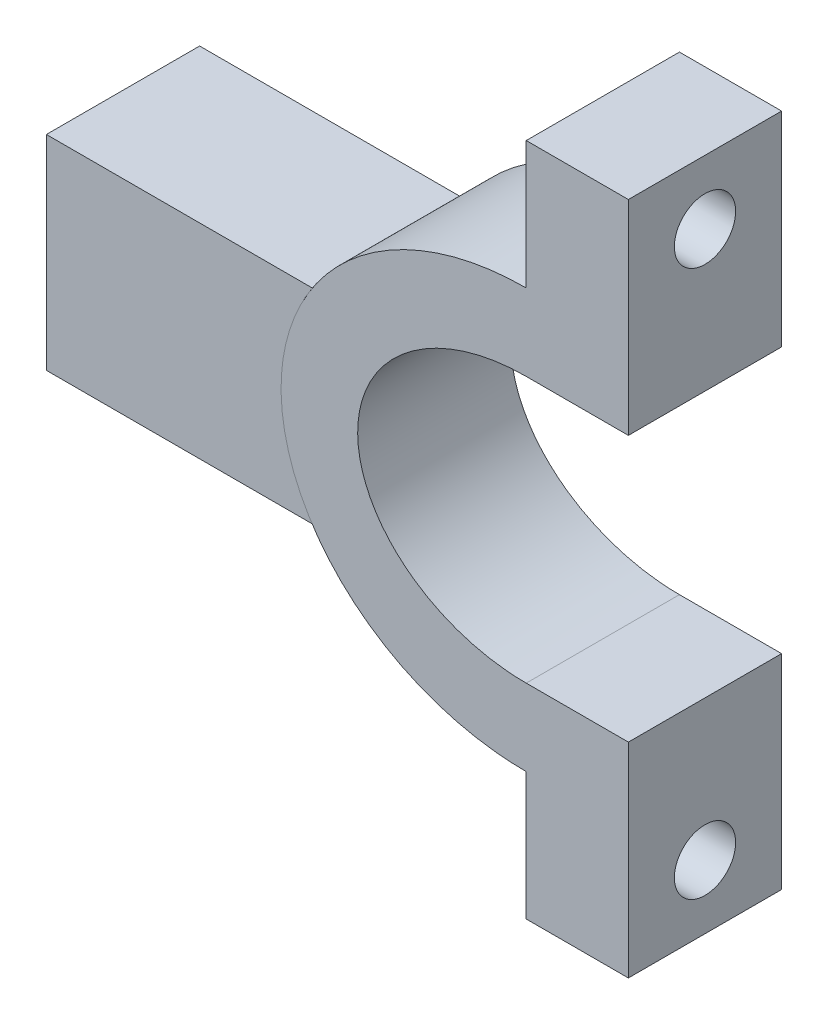
ISO-10303-21;
HEADER;
FILE_DESCRIPTION(('STEP AP214'),'2;1');
FILE_NAME('part.step','',(''),(''),'','','');
FILE_SCHEMA(('AUTOMOTIVE_DESIGN { 1 0 10303 214 1 1 1 1 }'));
ENDSEC;
DATA;
#1=APPLICATION_CONTEXT('core data for automotive mechanical design processes');
#2=APPLICATION_PROTOCOL_DEFINITION('international standard','automotive_design',2000,#1);
#3=PRODUCT_CONTEXT('',#1,'mechanical');
#4=PRODUCT('Part','Part','',(#3));
#5=PRODUCT_RELATED_PRODUCT_CATEGORY('part','',(#4));
#6=PRODUCT_DEFINITION_FORMATION('','',#4);
#7=PRODUCT_DEFINITION_CONTEXT('part definition',#1,'design');
#8=PRODUCT_DEFINITION('design','',#6,#7);
#9=PRODUCT_DEFINITION_SHAPE('','',#8);
#10=(LENGTH_UNIT() NAMED_UNIT(*) SI_UNIT(.MILLI.,.METRE.));
#11=(NAMED_UNIT(*) PLANE_ANGLE_UNIT() SI_UNIT($,.RADIAN.));
#12=(NAMED_UNIT(*) SI_UNIT($,.STERADIAN.) SOLID_ANGLE_UNIT());
#13=UNCERTAINTY_MEASURE_WITH_UNIT(LENGTH_MEASURE(1.E-05),#10,'distance_accuracy_value','');
#14=(GEOMETRIC_REPRESENTATION_CONTEXT(3) GLOBAL_UNCERTAINTY_ASSIGNED_CONTEXT((#13)) GLOBAL_UNIT_ASSIGNED_CONTEXT((#10,
#11,#12)) REPRESENTATION_CONTEXT('',''));
#15=CARTESIAN_POINT('',(0.,0.,0.));
#16=DIRECTION('',(0.,0.,1.));
#17=DIRECTION('',(1.,0.,0.));
#18=AXIS2_PLACEMENT_3D('',#15,#16,#17);
#19=CARTESIAN_POINT('',(0.,0.,15.));
#20=DIRECTION('',(0.,0.,1.));
#21=DIRECTION('',(1.,0.,0.));
#22=AXIS2_PLACEMENT_3D('',#19,#20,#21);
#23=ELLIPSE('',#22,24.,20.5);
#24=DIRECTION('',(0.,0.,-1.));
#25=VECTOR('',#24,1.);
#26=SURFACE_OF_LINEAR_EXTRUSION('',#23,#25);
#27=DIRECTION('',(0.,0.,-1.));
#28=VECTOR('',#27,1.);
#29=CARTESIAN_POINT('',(-20.9508645871297,-10.,15.));
#30=LINE('',#29,#28);
#31=CARTESIAN_POINT('',(-20.9508645871297,-10.,0.));
#32=VERTEX_POINT('',#31);
#33=CARTESIAN_POINT('',(-20.9508645871297,-10.,14.9726655230603));
#34=VERTEX_POINT('',#33);
#35=EDGE_CURVE('E273',#32,#34,#30,.F.);
#36=ORIENTED_EDGE('',*,*,#35,.F.);
#37=CARTESIAN_POINT('',(0.,0.,0.));
#38=DIRECTION('',(0.,0.,1.));
#39=DIRECTION('',(1.,0.,0.));
#40=AXIS2_PLACEMENT_3D('',#37,#38,#39);
#41=ELLIPSE('',#40,24.,20.5);
#42=CARTESIAN_POINT('',(0.,-20.5,0.));
#43=VERTEX_POINT('',#42);
#44=EDGE_CURVE('E275',#32,#43,#41,.T.);
#45=ORIENTED_EDGE('',*,*,#44,.T.);
#46=DIRECTION('',(0.,0.,-1.));
#47=VECTOR('',#46,1.);
#48=CARTESIAN_POINT('',(0.,-20.5,15.));
#49=LINE('',#48,#47);
#50=CARTESIAN_POINT('',(0.,-20.5,15.));
#51=VERTEX_POINT('',#50);
#52=EDGE_CURVE('E386',#51,#43,#49,.T.);
#53=ORIENTED_EDGE('',*,*,#52,.F.);
#54=CARTESIAN_POINT('',(0.,20.5,15.));
#55=VERTEX_POINT('',#54);
#56=EDGE_CURVE('E276',#55,#51,#23,.T.);
#57=ORIENTED_EDGE('',*,*,#56,.F.);
#58=DIRECTION('',(0.,0.,-1.));
#59=VECTOR('',#58,1.);
#60=CARTESIAN_POINT('',(0.,20.5,15.));
#61=LINE('',#60,#59);
#62=CARTESIAN_POINT('',(0.,20.5,0.));
#63=VERTEX_POINT('',#62);
#64=EDGE_CURVE('E383',#55,#63,#61,.T.);
#65=ORIENTED_EDGE('',*,*,#64,.T.);
#66=CARTESIAN_POINT('',(-20.9508645871297,9.99999999999999,0.));
#67=VERTEX_POINT('',#66);
#68=EDGE_CURVE('E286',#63,#67,#41,.T.);
#69=ORIENTED_EDGE('',*,*,#68,.T.);
#70=DIRECTION('',(0.,0.,-1.));
#71=VECTOR('',#70,1.);
#72=CARTESIAN_POINT('',(-20.9508645871297,9.99999999999999,15.));
#73=LINE('',#72,#71);
#74=CARTESIAN_POINT('',(-20.9508645871297,9.99999999999999,14.9726655230603));
#75=VERTEX_POINT('',#74);
#76=EDGE_CURVE('E66',#75,#67,#73,.T.);
#77=ORIENTED_EDGE('',*,*,#76,.F.);
#78=CARTESIAN_POINT('',(0.,0.,14.9726655230603));
#79=DIRECTION('',(0.,0.,1.));
#80=DIRECTION('',(1.,0.,0.));
#81=AXIS2_PLACEMENT_3D('',#78,#79,#80);
#82=ELLIPSE('',#81,24.,20.5);
#83=EDGE_CURVE('E11',#34,#75,#82,.F.);
#84=ORIENTED_EDGE('',*,*,#83,.F.);
#85=EDGE_LOOP('',(#36,#45,#53,#57,#65,#69,#77,#84));
#86=FACE_BOUND('',#85,.T.);
#87=ADVANCED_FACE('F47',(#86),#26,.F.);
#88=CARTESIAN_POINT('',(0.,0.,0.));
#89=DIRECTION('',(0.,0.,1.));
#90=DIRECTION('',(1.,0.,0.));
#91=AXIS2_PLACEMENT_3D('',#88,#89,#90);
#92=PLANE('',#91);
#93=DIRECTION('',(-1.,0.,0.));
#94=VECTOR('',#93,1.);
#95=CARTESIAN_POINT('',(0.,-10.,0.));
#96=LINE('',#95,#94);
#97=CARTESIAN_POINT('',(-19.,-10.,0.));
#98=VERTEX_POINT('',#97);
#99=EDGE_CURVE('E56',#98,#32,#96,.T.);
#100=ORIENTED_EDGE('',*,*,#99,.F.);
#101=DIRECTION('',(0.,-1.,0.));
#102=VECTOR('',#101,1.);
#103=CARTESIAN_POINT('',(-19.,0.,0.));
#104=LINE('',#103,#102);
#105=CARTESIAN_POINT('',(-19.,9.99999999999999,0.));
#106=VERTEX_POINT('',#105);
#107=EDGE_CURVE('E378',#106,#98,#104,.T.);
#108=ORIENTED_EDGE('',*,*,#107,.F.);
#109=DIRECTION('',(1.,0.,0.));
#110=VECTOR('',#109,1.);
#111=CARTESIAN_POINT('',(0.,9.99999999999999,0.));
#112=LINE('',#111,#110);
#113=EDGE_CURVE('E375',#67,#106,#112,.T.);
#114=ORIENTED_EDGE('',*,*,#113,.F.);
#115=ORIENTED_EDGE('',*,*,#68,.F.);
#116=DIRECTION('',(0.,1.,0.));
#117=VECTOR('',#116,1.);
#118=CARTESIAN_POINT('',(0.,13.,0.));
#119=LINE('',#118,#117);
#120=CARTESIAN_POINT('',(0.,33.,0.));
#121=VERTEX_POINT('',#120);
#122=EDGE_CURVE('E409',#63,#121,#119,.T.);
#123=ORIENTED_EDGE('',*,*,#122,.T.);
#124=DIRECTION('',(-1.,0.,0.));
#125=VECTOR('',#124,1.);
#126=CARTESIAN_POINT('',(10.,33.,0.));
#127=LINE('',#126,#125);
#128=CARTESIAN_POINT('',(10.,33.,0.));
#129=VERTEX_POINT('',#128);
#130=EDGE_CURVE('E194',#129,#121,#127,.T.);
#131=ORIENTED_EDGE('',*,*,#130,.F.);
#132=DIRECTION('',(0.,1.,0.));
#133=VECTOR('',#132,1.);
#134=CARTESIAN_POINT('',(10.,13.,0.));
#135=LINE('',#134,#133);
#136=CARTESIAN_POINT('',(10.,13.,0.));
#137=VERTEX_POINT('',#136);
#138=EDGE_CURVE('E169',#137,#129,#135,.T.);
#139=ORIENTED_EDGE('',*,*,#138,.F.);
#140=DIRECTION('',(-1.,0.,0.));
#141=VECTOR('',#140,1.);
#142=CARTESIAN_POINT('',(10.,13.,0.));
#143=LINE('',#142,#141);
#144=CARTESIAN_POINT('',(0.,13.,0.));
#145=VERTEX_POINT('',#144);
#146=EDGE_CURVE('E165',#137,#145,#143,.T.);
#147=ORIENTED_EDGE('',*,*,#146,.T.);
#148=CARTESIAN_POINT('',(0.,0.,0.));
#149=DIRECTION('',(0.,0.,1.));
#150=DIRECTION('',(1.,0.,0.));
#151=AXIS2_PLACEMENT_3D('',#148,#149,#150);
#152=ELLIPSE('',#151,16.5,13.);
#153=CARTESIAN_POINT('',(0.,-13.,0.));
#154=VERTEX_POINT('',#153);
#155=EDGE_CURVE('E281',#145,#154,#152,.T.);
#156=ORIENTED_EDGE('',*,*,#155,.T.);
#157=DIRECTION('',(-1.,0.,0.));
#158=VECTOR('',#157,1.);
#159=CARTESIAN_POINT('',(10.,-13.,0.));
#160=LINE('',#159,#158);
#161=CARTESIAN_POINT('',(10.,-13.,0.));
#162=VERTEX_POINT('',#161);
#163=EDGE_CURVE('E207',#162,#154,#160,.T.);
#164=ORIENTED_EDGE('',*,*,#163,.F.);
#165=DIRECTION('',(0.,1.,0.));
#166=VECTOR('',#165,1.);
#167=CARTESIAN_POINT('',(10.,-13.,0.));
#168=LINE('',#167,#166);
#169=CARTESIAN_POINT('',(10.,-33.,0.));
#170=VERTEX_POINT('',#169);
#171=EDGE_CURVE('E229',#170,#162,#168,.T.);
#172=ORIENTED_EDGE('',*,*,#171,.F.);
#173=DIRECTION('',(-1.,0.,0.));
#174=VECTOR('',#173,1.);
#175=CARTESIAN_POINT('',(10.,-33.,0.));
#176=LINE('',#175,#174);
#177=CARTESIAN_POINT('',(0.,-33.,0.));
#178=VERTEX_POINT('',#177);
#179=EDGE_CURVE('E202',#170,#178,#176,.T.);
#180=ORIENTED_EDGE('',*,*,#179,.T.);
#181=DIRECTION('',(0.,1.,0.));
#182=VECTOR('',#181,1.);
#183=CARTESIAN_POINT('',(0.,-13.,0.));
#184=LINE('',#183,#182);
#185=EDGE_CURVE('E215',#178,#43,#184,.T.);
#186=ORIENTED_EDGE('',*,*,#185,.T.);
#187=ORIENTED_EDGE('',*,*,#44,.F.);
#188=EDGE_LOOP('',(#100,#108,#114,#115,#123,#131,#139,#147,#156,#164,#172,#180,#186,#187));
#189=FACE_BOUND('',#188,.T.);
#190=ADVANCED_FACE('F291',(#189),#92,.F.);
#191=CARTESIAN_POINT('',(0.,0.,15.));
#192=DIRECTION('',(0.,0.,1.));
#193=DIRECTION('',(1.,0.,0.));
#194=AXIS2_PLACEMENT_3D('',#191,#192,#193);
#195=ELLIPSE('',#194,16.5,13.);
#196=DIRECTION('',(0.,0.,-1.));
#197=VECTOR('',#196,1.);
#198=SURFACE_OF_LINEAR_EXTRUSION('',#195,#197);
#199=ORIENTED_EDGE('',*,*,#155,.F.);
#200=DIRECTION('',(0.,0.,-1.));
#201=VECTOR('',#200,1.);
#202=CARTESIAN_POINT('',(0.,13.,15.));
#203=LINE('',#202,#201);
#204=CARTESIAN_POINT('',(0.,13.,15.));
#205=VERTEX_POINT('',#204);
#206=EDGE_CURVE('E285',#205,#145,#203,.T.);
#207=ORIENTED_EDGE('',*,*,#206,.F.);
#208=CARTESIAN_POINT('',(0.,-13.,15.));
#209=VERTEX_POINT('',#208);
#210=EDGE_CURVE('E184',#205,#209,#195,.T.);
#211=ORIENTED_EDGE('',*,*,#210,.T.);
#212=DIRECTION('',(0.,0.,-1.));
#213=VECTOR('',#212,1.);
#214=CARTESIAN_POINT('',(0.,-13.,15.));
#215=LINE('',#214,#213);
#216=EDGE_CURVE('E389',#209,#154,#215,.T.);
#217=ORIENTED_EDGE('',*,*,#216,.T.);
#218=EDGE_LOOP('',(#199,#207,#211,#217));
#219=FACE_BOUND('',#218,.T.);
#220=ADVANCED_FACE('F288',(#219),#198,.T.);
#221=CARTESIAN_POINT('',(0.,0.,15.));
#222=DIRECTION('',(0.,0.,1.));
#223=DIRECTION('',(1.,0.,0.));
#224=AXIS2_PLACEMENT_3D('',#221,#222,#223);
#225=PLANE('',#224);
#226=ORIENTED_EDGE('',*,*,#210,.F.);
#227=DIRECTION('',(-1.,0.,0.));
#228=VECTOR('',#227,1.);
#229=CARTESIAN_POINT('',(10.,13.,15.));
#230=LINE('',#229,#228);
#231=CARTESIAN_POINT('',(10.,13.,15.));
#232=VERTEX_POINT('',#231);
#233=EDGE_CURVE('E163',#232,#205,#230,.T.);
#234=ORIENTED_EDGE('',*,*,#233,.F.);
#235=DIRECTION('',(0.,-1.,0.));
#236=VECTOR('',#235,1.);
#237=CARTESIAN_POINT('',(10.,13.,15.));
#238=LINE('',#237,#236);
#239=CARTESIAN_POINT('',(10.,33.,15.));
#240=VERTEX_POINT('',#239);
#241=EDGE_CURVE('E170',#240,#232,#238,.T.);
#242=ORIENTED_EDGE('',*,*,#241,.F.);
#243=DIRECTION('',(-1.,0.,0.));
#244=VECTOR('',#243,1.);
#245=CARTESIAN_POINT('',(10.,33.,15.));
#246=LINE('',#245,#244);
#247=CARTESIAN_POINT('',(0.,33.,15.));
#248=VERTEX_POINT('',#247);
#249=EDGE_CURVE('E423',#240,#248,#246,.T.);
#250=ORIENTED_EDGE('',*,*,#249,.T.);
#251=DIRECTION('',(0.,-1.,0.));
#252=VECTOR('',#251,1.);
#253=CARTESIAN_POINT('',(0.,13.,15.));
#254=LINE('',#253,#252);
#255=EDGE_CURVE('E226',#248,#55,#254,.T.);
#256=ORIENTED_EDGE('',*,*,#255,.T.);
#257=ORIENTED_EDGE('',*,*,#56,.T.);
#258=DIRECTION('',(0.,-1.,0.));
#259=VECTOR('',#258,1.);
#260=CARTESIAN_POINT('',(0.,-13.,15.));
#261=LINE('',#260,#259);
#262=CARTESIAN_POINT('',(0.,-33.,15.));
#263=VERTEX_POINT('',#262);
#264=EDGE_CURVE('E223',#51,#263,#261,.T.);
#265=ORIENTED_EDGE('',*,*,#264,.T.);
#266=DIRECTION('',(-1.,0.,0.));
#267=VECTOR('',#266,1.);
#268=CARTESIAN_POINT('',(10.,-33.,15.));
#269=LINE('',#268,#267);
#270=CARTESIAN_POINT('',(10.,-33.,15.));
#271=VERTEX_POINT('',#270);
#272=EDGE_CURVE('E198',#271,#263,#269,.T.);
#273=ORIENTED_EDGE('',*,*,#272,.F.);
#274=DIRECTION('',(0.,-1.,0.));
#275=VECTOR('',#274,1.);
#276=CARTESIAN_POINT('',(10.,-13.,15.));
#277=LINE('',#276,#275);
#278=CARTESIAN_POINT('',(10.,-13.,15.));
#279=VERTEX_POINT('',#278);
#280=EDGE_CURVE('E220',#279,#271,#277,.T.);
#281=ORIENTED_EDGE('',*,*,#280,.F.);
#282=DIRECTION('',(-1.,0.,0.));
#283=VECTOR('',#282,1.);
#284=CARTESIAN_POINT('',(10.,-13.,15.));
#285=LINE('',#284,#283);
#286=EDGE_CURVE('E211',#279,#209,#285,.T.);
#287=ORIENTED_EDGE('',*,*,#286,.T.);
#288=EDGE_LOOP('',(#226,#234,#242,#250,#256,#257,#265,#273,#281,#287));
#289=FACE_BOUND('',#288,.T.);
#290=ADVANCED_FACE('F182',(#289),#225,.T.);
#291=CARTESIAN_POINT('',(-19.,-10.,-0.0273344769397066));
#292=DIRECTION('',(0.,1.,0.));
#293=DIRECTION('',(0.,0.,1.));
#294=AXIS2_PLACEMENT_3D('',#291,#292,#293);
#295=PLANE('',#294);
#296=ORIENTED_EDGE('',*,*,#99,.T.);
#297=ORIENTED_EDGE('',*,*,#35,.T.);
#298=DIRECTION('',(-1.,0.,0.));
#299=VECTOR('',#298,1.);
#300=CARTESIAN_POINT('',(-19.,-10.,14.9726655230603));
#301=LINE('',#300,#299);
#302=CARTESIAN_POINT('',(-47.,-10.,14.9726655230603));
#303=VERTEX_POINT('',#302);
#304=EDGE_CURVE('E268',#34,#303,#301,.T.);
#305=ORIENTED_EDGE('',*,*,#304,.T.);
#306=DIRECTION('',(0.,0.,-1.));
#307=VECTOR('',#306,1.);
#308=CARTESIAN_POINT('',(-47.,-10.,-0.0273344769397066));
#309=LINE('',#308,#307);
#310=CARTESIAN_POINT('',(-47.,-10.,-0.0273344769397066));
#311=VERTEX_POINT('',#310);
#312=EDGE_CURVE('E192',#303,#311,#309,.T.);
#313=ORIENTED_EDGE('',*,*,#312,.T.);
#314=DIRECTION('',(-1.,0.,0.));
#315=VECTOR('',#314,1.);
#316=CARTESIAN_POINT('',(-19.,-10.,-0.0273344769397066));
#317=LINE('',#316,#315);
#318=CARTESIAN_POINT('',(-19.,-10.,-0.0273344769397066));
#319=VERTEX_POINT('',#318);
#320=EDGE_CURVE('E265',#319,#311,#317,.T.);
#321=ORIENTED_EDGE('',*,*,#320,.F.);
#322=DIRECTION('',(0.,0.,-1.));
#323=VECTOR('',#322,1.);
#324=CARTESIAN_POINT('',(-19.,-10.,-0.0273344769397066));
#325=LINE('',#324,#323);
#326=EDGE_CURVE('E249',#98,#319,#325,.T.);
#327=ORIENTED_EDGE('',*,*,#326,.F.);
#328=EDGE_LOOP('',(#296,#297,#305,#313,#321,#327));
#329=FACE_BOUND('',#328,.T.);
#330=ADVANCED_FACE('F298',(#329),#295,.F.);
#331=CARTESIAN_POINT('',(-19.,9.99999999999999,-0.0273344769397017));
#332=DIRECTION('',(0.,-1.,0.));
#333=DIRECTION('',(0.,0.,-1.));
#334=AXIS2_PLACEMENT_3D('',#331,#332,#333);
#335=PLANE('',#334);
#336=DIRECTION('',(-1.,0.,0.));
#337=VECTOR('',#336,1.);
#338=CARTESIAN_POINT('',(-19.,9.99999999999999,14.9726655230603));
#339=LINE('',#338,#337);
#340=CARTESIAN_POINT('',(-47.,9.99999999999999,14.9726655230603));
#341=VERTEX_POINT('',#340);
#342=EDGE_CURVE('E259',#75,#341,#339,.T.);
#343=ORIENTED_EDGE('',*,*,#342,.F.);
#344=ORIENTED_EDGE('',*,*,#76,.T.);
#345=ORIENTED_EDGE('',*,*,#113,.T.);
#346=DIRECTION('',(0.,0.,1.));
#347=VECTOR('',#346,1.);
#348=CARTESIAN_POINT('',(-19.,9.99999999999999,-0.0273344769397017));
#349=LINE('',#348,#347);
#350=CARTESIAN_POINT('',(-19.,9.99999999999999,-0.0273344769397017));
#351=VERTEX_POINT('',#350);
#352=EDGE_CURVE('E255',#351,#106,#349,.T.);
#353=ORIENTED_EDGE('',*,*,#352,.F.);
#354=DIRECTION('',(-1.,0.,0.));
#355=VECTOR('',#354,1.);
#356=CARTESIAN_POINT('',(-19.,9.99999999999999,-0.0273344769397017));
#357=LINE('',#356,#355);
#358=CARTESIAN_POINT('',(-47.,9.99999999999999,-0.0273344769397017));
#359=VERTEX_POINT('',#358);
#360=EDGE_CURVE('E262',#351,#359,#357,.T.);
#361=ORIENTED_EDGE('',*,*,#360,.T.);
#362=DIRECTION('',(0.,0.,1.));
#363=VECTOR('',#362,1.);
#364=CARTESIAN_POINT('',(-47.,9.99999999999999,-0.0273344769397017));
#365=LINE('',#364,#363);
#366=EDGE_CURVE('E245',#359,#341,#365,.T.);
#367=ORIENTED_EDGE('',*,*,#366,.T.);
#368=EDGE_LOOP('',(#343,#344,#345,#353,#361,#367));
#369=FACE_BOUND('',#368,.T.);
#370=ADVANCED_FACE('F307',(#369),#335,.F.);
#371=CARTESIAN_POINT('',(-19.,0.,0.));
#372=DIRECTION('',(-1.,0.,0.));
#373=DIRECTION('',(0.,0.,1.));
#374=AXIS2_PLACEMENT_3D('',#371,#372,#373);
#375=PLANE('',#374);
#376=ORIENTED_EDGE('',*,*,#352,.T.);
#377=ORIENTED_EDGE('',*,*,#107,.T.);
#378=ORIENTED_EDGE('',*,*,#326,.T.);
#379=DIRECTION('',(0.,1.,0.));
#380=VECTOR('',#379,1.);
#381=CARTESIAN_POINT('',(-19.,9.99999999999999,-0.0273344769397017));
#382=LINE('',#381,#380);
#383=EDGE_CURVE('E252',#319,#351,#382,.T.);
#384=ORIENTED_EDGE('',*,*,#383,.T.);
#385=EDGE_LOOP('',(#376,#377,#378,#384));
#386=FACE_BOUND('',#385,.T.);
#387=ADVANCED_FACE('F303',(#386),#375,.F.);
#388=CARTESIAN_POINT('',(-19.,9.99999999999999,14.9726655230603));
#389=DIRECTION('',(0.,0.,-1.));
#390=DIRECTION('',(0.,1.,0.));
#391=AXIS2_PLACEMENT_3D('',#388,#389,#390);
#392=PLANE('',#391);
#393=ORIENTED_EDGE('',*,*,#304,.F.);
#394=ORIENTED_EDGE('',*,*,#83,.T.);
#395=ORIENTED_EDGE('',*,*,#342,.T.);
#396=DIRECTION('',(0.,-1.,0.));
#397=VECTOR('',#396,1.);
#398=CARTESIAN_POINT('',(-47.,9.99999999999999,14.9726655230603));
#399=LINE('',#398,#397);
#400=EDGE_CURVE('E187',#341,#303,#399,.T.);
#401=ORIENTED_EDGE('',*,*,#400,.T.);
#402=EDGE_LOOP('',(#393,#394,#395,#401));
#403=FACE_BOUND('',#402,.T.);
#404=ADVANCED_FACE('F299',(#403),#392,.F.);
#405=CARTESIAN_POINT('',(-19.,9.99999999999999,-0.0273344769397017));
#406=DIRECTION('',(0.,0.,1.));
#407=DIRECTION('',(0.,-1.,0.));
#408=AXIS2_PLACEMENT_3D('',#405,#406,#407);
#409=PLANE('',#408);
#410=ORIENTED_EDGE('',*,*,#320,.T.);
#411=DIRECTION('',(0.,1.,0.));
#412=VECTOR('',#411,1.);
#413=CARTESIAN_POINT('',(-47.,9.99999999999999,-0.0273344769397017));
#414=LINE('',#413,#412);
#415=EDGE_CURVE('E241',#311,#359,#414,.T.);
#416=ORIENTED_EDGE('',*,*,#415,.T.);
#417=ORIENTED_EDGE('',*,*,#360,.F.);
#418=ORIENTED_EDGE('',*,*,#383,.F.);
#419=EDGE_LOOP('',(#410,#416,#417,#418));
#420=FACE_BOUND('',#419,.T.);
#421=ADVANCED_FACE('F302',(#420),#409,.F.);
#422=CARTESIAN_POINT('',(-47.,0.,0.));
#423=DIRECTION('',(-1.,0.,0.));
#424=DIRECTION('',(0.,0.,1.));
#425=AXIS2_PLACEMENT_3D('',#422,#423,#424);
#426=PLANE('',#425);
#427=ORIENTED_EDGE('',*,*,#400,.F.);
#428=ORIENTED_EDGE('',*,*,#366,.F.);
#429=ORIENTED_EDGE('',*,*,#415,.F.);
#430=ORIENTED_EDGE('',*,*,#312,.F.);
#431=EDGE_LOOP('',(#427,#428,#429,#430));
#432=FACE_BOUND('',#431,.T.);
#433=ADVANCED_FACE('F311',(#432),#426,.T.);
#434=CARTESIAN_POINT('',(0.,0.,0.));
#435=DIRECTION('',(1.,0.,0.));
#436=DIRECTION('',(0.,1.,0.));
#437=AXIS2_PLACEMENT_3D('',#434,#435,#436);
#438=PLANE('',#437);
#439=CARTESIAN_POINT('',(0.,-26.75,7.49999999999996));
#440=DIRECTION('',(-1.,0.,0.));
#441=DIRECTION('',(0.,1.,0.));
#442=AXIS2_PLACEMENT_3D('',#439,#440,#441);
#443=CIRCLE('',#442,3.);
#444=CARTESIAN_POINT('',(0.,-23.75,7.49999999999996));
#445=VERTEX_POINT('',#444);
#446=EDGE_CURVE('E434',#445,#445,#443,.T.);
#447=ORIENTED_EDGE('',*,*,#446,.F.);
#448=EDGE_LOOP('',(#447));
#449=FACE_BOUND('',#448,.T.);
#450=ORIENTED_EDGE('',*,*,#264,.F.);
#451=ORIENTED_EDGE('',*,*,#52,.T.);
#452=ORIENTED_EDGE('',*,*,#185,.F.);
#453=DIRECTION('',(0.,0.,-1.));
#454=VECTOR('',#453,1.);
#455=CARTESIAN_POINT('',(0.,-33.,15.));
#456=LINE('',#455,#454);
#457=EDGE_CURVE('E219',#263,#178,#456,.T.);
#458=ORIENTED_EDGE('',*,*,#457,.F.);
#459=EDGE_LOOP('',(#450,#451,#452,#458));
#460=FACE_BOUND('',#459,.T.);
#461=ADVANCED_FACE('F321',(#449,#460),#438,.F.);
#462=CARTESIAN_POINT('',(10.,-33.,15.));
#463=DIRECTION('',(0.,1.,0.));
#464=DIRECTION('',(0.,0.,1.));
#465=AXIS2_PLACEMENT_3D('',#462,#463,#464);
#466=PLANE('',#465);
#467=ORIENTED_EDGE('',*,*,#457,.T.);
#468=ORIENTED_EDGE('',*,*,#179,.F.);
#469=DIRECTION('',(0.,0.,-1.));
#470=VECTOR('',#469,1.);
#471=CARTESIAN_POINT('',(10.,-33.,15.));
#472=LINE('',#471,#470);
#473=EDGE_CURVE('E232',#271,#170,#472,.T.);
#474=ORIENTED_EDGE('',*,*,#473,.F.);
#475=ORIENTED_EDGE('',*,*,#272,.T.);
#476=EDGE_LOOP('',(#467,#468,#474,#475));
#477=FACE_BOUND('',#476,.T.);
#478=ADVANCED_FACE('F331',(#477),#466,.F.);
#479=CARTESIAN_POINT('',(10.,-13.,15.));
#480=DIRECTION('',(0.,-1.,0.));
#481=DIRECTION('',(0.,0.,-1.));
#482=AXIS2_PLACEMENT_3D('',#479,#480,#481);
#483=PLANE('',#482);
#484=ORIENTED_EDGE('',*,*,#216,.F.);
#485=ORIENTED_EDGE('',*,*,#286,.F.);
#486=DIRECTION('',(0.,0.,1.));
#487=VECTOR('',#486,1.);
#488=CARTESIAN_POINT('',(10.,-13.,15.));
#489=LINE('',#488,#487);
#490=EDGE_CURVE('E214',#162,#279,#489,.T.);
#491=ORIENTED_EDGE('',*,*,#490,.F.);
#492=ORIENTED_EDGE('',*,*,#163,.T.);
#493=EDGE_LOOP('',(#484,#485,#491,#492));
#494=FACE_BOUND('',#493,.T.);
#495=ADVANCED_FACE('F327',(#494),#483,.F.);
#496=CARTESIAN_POINT('',(10.,0.,0.));
#497=DIRECTION('',(1.,0.,0.));
#498=DIRECTION('',(0.,1.,0.));
#499=AXIS2_PLACEMENT_3D('',#496,#497,#498);
#500=PLANE('',#499);
#501=CARTESIAN_POINT('',(10.,-26.75,7.49999999999996));
#502=DIRECTION('',(-1.,0.,0.));
#503=DIRECTION('',(0.,1.,0.));
#504=AXIS2_PLACEMENT_3D('',#501,#502,#503);
#505=CIRCLE('',#504,3.);
#506=CARTESIAN_POINT('',(10.,-23.75,7.49999999999996));
#507=VERTEX_POINT('',#506);
#508=EDGE_CURVE('E430',#507,#507,#505,.T.);
#509=ORIENTED_EDGE('',*,*,#508,.T.);
#510=EDGE_LOOP('',(#509));
#511=FACE_BOUND('',#510,.T.);
#512=ORIENTED_EDGE('',*,*,#280,.T.);
#513=ORIENTED_EDGE('',*,*,#473,.T.);
#514=ORIENTED_EDGE('',*,*,#171,.T.);
#515=ORIENTED_EDGE('',*,*,#490,.T.);
#516=EDGE_LOOP('',(#512,#513,#514,#515));
#517=FACE_BOUND('',#516,.T.);
#518=ADVANCED_FACE('F323',(#511,#517),#500,.T.);
#519=CARTESIAN_POINT('',(0.,0.,0.));
#520=DIRECTION('',(-1.,0.,0.));
#521=DIRECTION('',(0.,-1.,0.));
#522=AXIS2_PLACEMENT_3D('',#519,#520,#521);
#523=PLANE('',#522);
#524=CARTESIAN_POINT('',(0.,26.75,7.5));
#525=DIRECTION('',(-1.,0.,0.));
#526=DIRECTION('',(0.,-1.,0.));
#527=AXIS2_PLACEMENT_3D('',#524,#525,#526);
#528=CIRCLE('',#527,3.);
#529=CARTESIAN_POINT('',(0.,23.75,7.5));
#530=VERTEX_POINT('',#529);
#531=EDGE_CURVE('E438',#530,#530,#528,.T.);
#532=ORIENTED_EDGE('',*,*,#531,.F.);
#533=EDGE_LOOP('',(#532));
#534=FACE_BOUND('',#533,.T.);
#535=ORIENTED_EDGE('',*,*,#64,.F.);
#536=ORIENTED_EDGE('',*,*,#255,.F.);
#537=DIRECTION('',(0.,0.,1.));
#538=VECTOR('',#537,1.);
#539=CARTESIAN_POINT('',(0.,33.,15.));
#540=LINE('',#539,#538);
#541=EDGE_CURVE('E180',#121,#248,#540,.T.);
#542=ORIENTED_EDGE('',*,*,#541,.F.);
#543=ORIENTED_EDGE('',*,*,#122,.F.);
#544=EDGE_LOOP('',(#535,#536,#542,#543));
#545=FACE_BOUND('',#544,.T.);
#546=ADVANCED_FACE('F326',(#534,#545),#523,.T.);
#547=CARTESIAN_POINT('',(10.,13.,15.));
#548=DIRECTION('',(0.,1.,0.));
#549=DIRECTION('',(-1.,0.,0.));
#550=AXIS2_PLACEMENT_3D('',#547,#548,#549);
#551=PLANE('',#550);
#552=ORIENTED_EDGE('',*,*,#206,.T.);
#553=ORIENTED_EDGE('',*,*,#146,.F.);
#554=DIRECTION('',(0.,0.,-1.));
#555=VECTOR('',#554,1.);
#556=CARTESIAN_POINT('',(10.,13.,15.));
#557=LINE('',#556,#555);
#558=EDGE_CURVE('E158',#232,#137,#557,.T.);
#559=ORIENTED_EDGE('',*,*,#558,.F.);
#560=ORIENTED_EDGE('',*,*,#233,.T.);
#561=EDGE_LOOP('',(#552,#553,#559,#560));
#562=FACE_BOUND('',#561,.T.);
#563=ADVANCED_FACE('F161',(#562),#551,.F.);
#564=CARTESIAN_POINT('',(10.,33.,15.));
#565=DIRECTION('',(0.,-1.,0.));
#566=DIRECTION('',(1.,0.,0.));
#567=AXIS2_PLACEMENT_3D('',#564,#565,#566);
#568=PLANE('',#567);
#569=ORIENTED_EDGE('',*,*,#541,.T.);
#570=ORIENTED_EDGE('',*,*,#249,.F.);
#571=DIRECTION('',(0.,0.,1.));
#572=VECTOR('',#571,1.);
#573=CARTESIAN_POINT('',(10.,33.,15.));
#574=LINE('',#573,#572);
#575=EDGE_CURVE('E175',#129,#240,#574,.T.);
#576=ORIENTED_EDGE('',*,*,#575,.F.);
#577=ORIENTED_EDGE('',*,*,#130,.T.);
#578=EDGE_LOOP('',(#569,#570,#576,#577));
#579=FACE_BOUND('',#578,.T.);
#580=ADVANCED_FACE('F341',(#579),#568,.F.);
#581=CARTESIAN_POINT('',(10.,0.,0.));
#582=DIRECTION('',(-1.,0.,0.));
#583=DIRECTION('',(0.,-1.,0.));
#584=AXIS2_PLACEMENT_3D('',#581,#582,#583);
#585=PLANE('',#584);
#586=CARTESIAN_POINT('',(10.,26.75,7.5));
#587=DIRECTION('',(-1.,0.,0.));
#588=DIRECTION('',(0.,-1.,0.));
#589=AXIS2_PLACEMENT_3D('',#586,#587,#588);
#590=CIRCLE('',#589,3.);
#591=CARTESIAN_POINT('',(10.,23.75,7.5));
#592=VERTEX_POINT('',#591);
#593=EDGE_CURVE('E203',#592,#592,#590,.T.);
#594=ORIENTED_EDGE('',*,*,#593,.T.);
#595=EDGE_LOOP('',(#594));
#596=FACE_BOUND('',#595,.T.);
#597=ORIENTED_EDGE('',*,*,#241,.T.);
#598=ORIENTED_EDGE('',*,*,#558,.T.);
#599=ORIENTED_EDGE('',*,*,#138,.T.);
#600=ORIENTED_EDGE('',*,*,#575,.T.);
#601=EDGE_LOOP('',(#597,#598,#599,#600));
#602=FACE_BOUND('',#601,.T.);
#603=ADVANCED_FACE('F173',(#596,#602),#585,.F.);
#604=CARTESIAN_POINT('',(10.,26.75,7.5));
#605=DIRECTION('',(-1.,0.,0.));
#606=DIRECTION('',(0.,-1.,0.));
#607=AXIS2_PLACEMENT_3D('',#604,#605,#606);
#608=CYLINDRICAL_SURFACE('',#607,3.);
#609=ORIENTED_EDGE('',*,*,#593,.F.);
#610=EDGE_LOOP('',(#609));
#611=FACE_BOUND('',#610,.T.);
#612=ORIENTED_EDGE('',*,*,#531,.T.);
#613=EDGE_LOOP('',(#612));
#614=FACE_BOUND('',#613,.T.);
#615=ADVANCED_FACE('F350',(#611,#614),#608,.F.);
#616=CARTESIAN_POINT('',(10.,-26.75,7.49999999999996));
#617=DIRECTION('',(-1.,0.,0.));
#618=DIRECTION('',(0.,-1.,0.));
#619=AXIS2_PLACEMENT_3D('',#616,#617,#618);
#620=CYLINDRICAL_SURFACE('',#619,3.);
#621=ORIENTED_EDGE('',*,*,#508,.F.);
#622=EDGE_LOOP('',(#621));
#623=FACE_BOUND('',#622,.T.);
#624=ORIENTED_EDGE('',*,*,#446,.T.);
#625=EDGE_LOOP('',(#624));
#626=FACE_BOUND('',#625,.T.);
#627=ADVANCED_FACE('F352',(#623,#626),#620,.F.);
#628=CLOSED_SHELL('',(#87,#190,#220,#290,#330,#370,#387,#404,#421,#433,#461,#478,#495,#518,#546,
#563,#580,#603,#615,#627));
#629=MANIFOLD_SOLID_BREP('B2',#628);
#630=ADVANCED_BREP_SHAPE_REPRESENTATION('',(#18,#629),#14);
#631=SHAPE_DEFINITION_REPRESENTATION(#9,#630);
ENDSEC;
END-ISO-10303-21;
